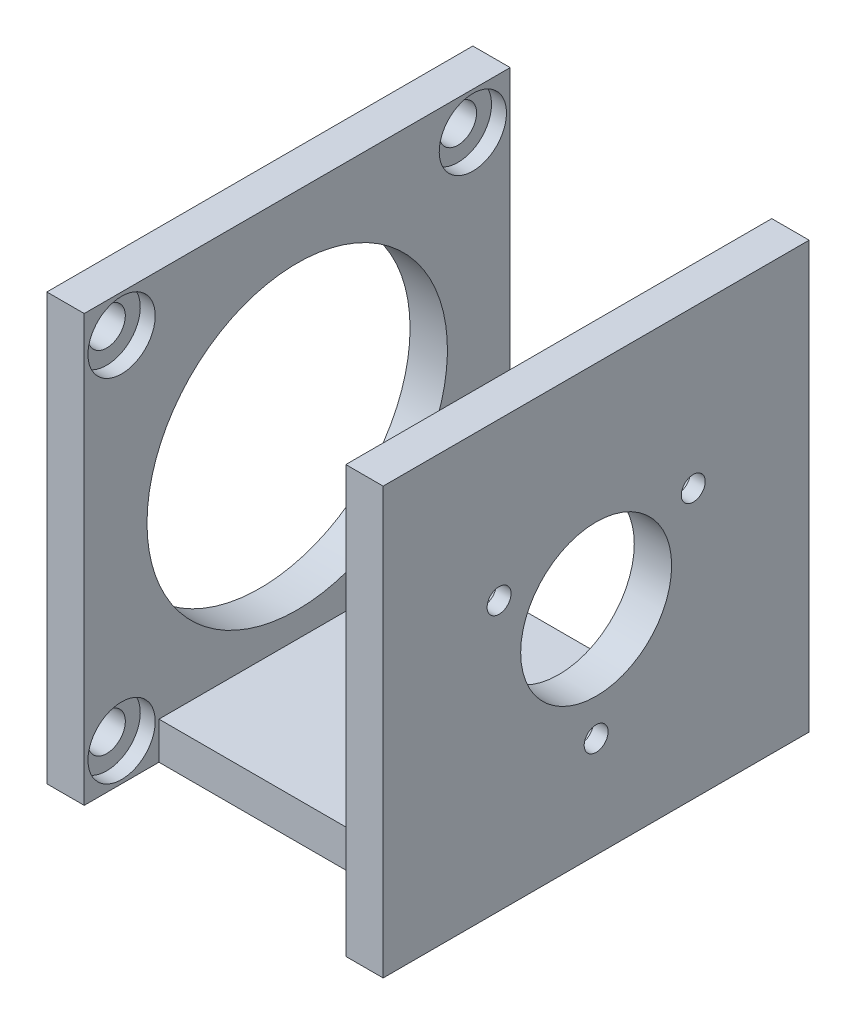
ISO-10303-21;
HEADER;
FILE_DESCRIPTION(('STEP AP214'),'2;1');
FILE_NAME('part.step','',(''),(''),'','','');
FILE_SCHEMA(('AUTOMOTIVE_DESIGN { 1 0 10303 214 1 1 1 1 }'));
ENDSEC;
DATA;
#1=APPLICATION_CONTEXT('core data for automotive mechanical design processes');
#2=APPLICATION_PROTOCOL_DEFINITION('international standard','automotive_design',2000,#1);
#3=PRODUCT_CONTEXT('',#1,'mechanical');
#4=PRODUCT('Part','Part','',(#3));
#5=PRODUCT_RELATED_PRODUCT_CATEGORY('part','',(#4));
#6=PRODUCT_DEFINITION_FORMATION('','',#4);
#7=PRODUCT_DEFINITION_CONTEXT('part definition',#1,'design');
#8=PRODUCT_DEFINITION('design','',#6,#7);
#9=PRODUCT_DEFINITION_SHAPE('','',#8);
#10=(LENGTH_UNIT() NAMED_UNIT(*) SI_UNIT(.MILLI.,.METRE.));
#11=(NAMED_UNIT(*) PLANE_ANGLE_UNIT() SI_UNIT($,.RADIAN.));
#12=(NAMED_UNIT(*) SI_UNIT($,.STERADIAN.) SOLID_ANGLE_UNIT());
#13=UNCERTAINTY_MEASURE_WITH_UNIT(LENGTH_MEASURE(1.E-05),#10,'distance_accuracy_value','');
#14=(GEOMETRIC_REPRESENTATION_CONTEXT(3) GLOBAL_UNCERTAINTY_ASSIGNED_CONTEXT((#13)) GLOBAL_UNIT_ASSIGNED_CONTEXT((#10,
#11,#12)) REPRESENTATION_CONTEXT('',''));
#15=CARTESIAN_POINT('',(0.,0.,0.));
#16=DIRECTION('',(0.,0.,1.));
#17=DIRECTION('',(1.,0.,0.));
#18=AXIS2_PLACEMENT_3D('',#15,#16,#17);
#19=CARTESIAN_POINT('',(-0.00100000000000794,35.9999999999999,15.5096189432333));
#20=DIRECTION('',(1.,0.,0.));
#21=DIRECTION('',(0.,1.,0.));
#22=AXIS2_PLACEMENT_3D('',#19,#20,#21);
#23=CYLINDRICAL_SURFACE('',#22,1.6);
#24=CARTESIAN_POINT('',(45.,35.9999999999999,15.5096189432333));
#25=DIRECTION('',(1.,0.,0.));
#26=DIRECTION('',(0.,1.,0.));
#27=AXIS2_PLACEMENT_3D('',#24,#25,#26);
#28=CIRCLE('',#27,1.6);
#29=CARTESIAN_POINT('',(45.,37.5999999999999,15.5096189432333));
#30=VERTEX_POINT('',#29);
#31=EDGE_CURVE('E177',#30,#30,#28,.T.);
#32=ORIENTED_EDGE('',*,*,#31,.T.);
#33=EDGE_LOOP('',(#32));
#34=FACE_BOUND('',#33,.T.);
#35=CARTESIAN_POINT('',(43.,35.9999999999999,15.5096189432333));
#36=DIRECTION('',(-1.,0.,0.));
#37=DIRECTION('',(0.,0.,1.));
#38=AXIS2_PLACEMENT_3D('',#35,#36,#37);
#39=CIRCLE('',#38,1.6);
#40=CARTESIAN_POINT('',(43.,35.9999999999999,17.1096189432333));
#41=VERTEX_POINT('',#40);
#42=EDGE_CURVE('E47',#41,#41,#39,.F.);
#43=ORIENTED_EDGE('',*,*,#42,.F.);
#44=EDGE_LOOP('',(#43));
#45=FACE_BOUND('',#44,.T.);
#46=ADVANCED_FACE('F43',(#34,#45),#23,.F.);
#47=CARTESIAN_POINT('',(-0.00100000000000794,36.0000000000001,41.4903810567665));
#48=DIRECTION('',(1.,0.,0.));
#49=DIRECTION('',(0.,1.,0.));
#50=AXIS2_PLACEMENT_3D('',#47,#48,#49);
#51=CYLINDRICAL_SURFACE('',#50,1.6);
#52=CARTESIAN_POINT('',(45.,36.0000000000001,41.4903810567665));
#53=DIRECTION('',(1.,0.,0.));
#54=DIRECTION('',(0.,1.,0.));
#55=AXIS2_PLACEMENT_3D('',#52,#53,#54);
#56=CIRCLE('',#55,1.6);
#57=CARTESIAN_POINT('',(45.,37.6000000000001,41.4903810567665));
#58=VERTEX_POINT('',#57);
#59=EDGE_CURVE('E181',#58,#58,#56,.T.);
#60=ORIENTED_EDGE('',*,*,#59,.T.);
#61=EDGE_LOOP('',(#60));
#62=FACE_BOUND('',#61,.T.);
#63=CARTESIAN_POINT('',(43.,36.0000000000001,41.4903810567665));
#64=DIRECTION('',(-1.,0.,0.));
#65=DIRECTION('',(0.,0.,1.));
#66=AXIS2_PLACEMENT_3D('',#63,#64,#65);
#67=CIRCLE('',#66,1.6);
#68=CARTESIAN_POINT('',(43.,36.0000000000001,43.0903810567665));
#69=VERTEX_POINT('',#68);
#70=EDGE_CURVE('E171',#69,#69,#67,.F.);
#71=ORIENTED_EDGE('',*,*,#70,.F.);
#72=EDGE_LOOP('',(#71));
#73=FACE_BOUND('',#72,.T.);
#74=ADVANCED_FACE('F347',(#62,#73),#51,.F.);
#75=CARTESIAN_POINT('',(-0.001000000000001,13.5,28.5));
#76=DIRECTION('',(1.,0.,0.));
#77=DIRECTION('',(0.,1.,0.));
#78=AXIS2_PLACEMENT_3D('',#75,#76,#77);
#79=CYLINDRICAL_SURFACE('',#78,1.6);
#80=CARTESIAN_POINT('',(45.,13.5,28.5));
#81=DIRECTION('',(1.,0.,0.));
#82=DIRECTION('',(0.,1.,0.));
#83=AXIS2_PLACEMENT_3D('',#80,#81,#82);
#84=CIRCLE('',#83,1.6);
#85=CARTESIAN_POINT('',(45.,15.1,28.5));
#86=VERTEX_POINT('',#85);
#87=EDGE_CURVE('E186',#86,#86,#84,.T.);
#88=ORIENTED_EDGE('',*,*,#87,.T.);
#89=EDGE_LOOP('',(#88));
#90=FACE_BOUND('',#89,.T.);
#91=CARTESIAN_POINT('',(43.,13.5,28.5));
#92=DIRECTION('',(-1.,0.,0.));
#93=DIRECTION('',(0.,0.,1.));
#94=AXIS2_PLACEMENT_3D('',#91,#92,#93);
#95=CIRCLE('',#94,1.6);
#96=CARTESIAN_POINT('',(43.,13.5,30.1));
#97=VERTEX_POINT('',#96);
#98=EDGE_CURVE('E169',#97,#97,#95,.F.);
#99=ORIENTED_EDGE('',*,*,#98,.F.);
#100=EDGE_LOOP('',(#99));
#101=FACE_BOUND('',#100,.T.);
#102=ADVANCED_FACE('F352',(#90,#101),#79,.F.);
#103=CARTESIAN_POINT('',(0.,0.,57.));
#104=DIRECTION('',(0.,0.,-1.));
#105=DIRECTION('',(-1.,0.,0.));
#106=AXIS2_PLACEMENT_3D('',#103,#104,#105);
#107=PLANE('',#106);
#108=DIRECTION('',(1.,0.,0.));
#109=VECTOR('',#108,1.);
#110=CARTESIAN_POINT('',(45.,0.,57.));
#111=LINE('',#110,#109);
#112=CARTESIAN_POINT('',(0.,0.,57.));
#113=VERTEX_POINT('',#112);
#114=CARTESIAN_POINT('',(5.,0.,57.));
#115=VERTEX_POINT('',#114);
#116=EDGE_CURVE('E120',#113,#115,#111,.T.);
#117=ORIENTED_EDGE('',*,*,#116,.T.);
#118=DIRECTION('',(0.,1.,0.));
#119=VECTOR('',#118,1.);
#120=CARTESIAN_POINT('',(5.,57.,57.));
#121=LINE('',#120,#119);
#122=CARTESIAN_POINT('',(5.,57.,57.));
#123=VERTEX_POINT('',#122);
#124=EDGE_CURVE('E112',#115,#123,#121,.T.);
#125=ORIENTED_EDGE('',*,*,#124,.T.);
#126=DIRECTION('',(-1.,0.,0.));
#127=VECTOR('',#126,1.);
#128=CARTESIAN_POINT('',(0.,57.,57.));
#129=LINE('',#128,#127);
#130=CARTESIAN_POINT('',(0.,57.,57.));
#131=VERTEX_POINT('',#130);
#132=EDGE_CURVE('E116',#123,#131,#129,.T.);
#133=ORIENTED_EDGE('',*,*,#132,.T.);
#134=DIRECTION('',(0.,-1.,0.));
#135=VECTOR('',#134,1.);
#136=CARTESIAN_POINT('',(0.,0.,57.));
#137=LINE('',#136,#135);
#138=EDGE_CURVE('E69',#131,#113,#137,.T.);
#139=ORIENTED_EDGE('',*,*,#138,.T.);
#140=EDGE_LOOP('',(#117,#125,#133,#139));
#141=FACE_BOUND('',#140,.T.);
#142=ADVANCED_FACE('F114',(#141),#107,.F.);
#143=CARTESIAN_POINT('',(0.,0.,0.));
#144=DIRECTION('',(0.,0.,-1.));
#145=DIRECTION('',(-1.,0.,0.));
#146=AXIS2_PLACEMENT_3D('',#143,#144,#145);
#147=PLANE('',#146);
#148=DIRECTION('',(0.,1.,0.));
#149=VECTOR('',#148,1.);
#150=CARTESIAN_POINT('',(5.,57.,0.));
#151=LINE('',#150,#149);
#152=CARTESIAN_POINT('',(5.,0.,0.));
#153=VERTEX_POINT('',#152);
#154=CARTESIAN_POINT('',(5.,57.,0.));
#155=VERTEX_POINT('',#154);
#156=EDGE_CURVE('E130',#153,#155,#151,.T.);
#157=ORIENTED_EDGE('',*,*,#156,.F.);
#158=DIRECTION('',(1.,0.,0.));
#159=VECTOR('',#158,1.);
#160=CARTESIAN_POINT('',(45.,0.,0.));
#161=LINE('',#160,#159);
#162=CARTESIAN_POINT('',(0.,0.,0.));
#163=VERTEX_POINT('',#162);
#164=EDGE_CURVE('E142',#163,#153,#161,.T.);
#165=ORIENTED_EDGE('',*,*,#164,.F.);
#166=DIRECTION('',(0.,-1.,0.));
#167=VECTOR('',#166,1.);
#168=CARTESIAN_POINT('',(0.,0.,0.));
#169=LINE('',#168,#167);
#170=CARTESIAN_POINT('',(0.,57.,0.));
#171=VERTEX_POINT('',#170);
#172=EDGE_CURVE('E96',#171,#163,#169,.T.);
#173=ORIENTED_EDGE('',*,*,#172,.F.);
#174=DIRECTION('',(-1.,0.,0.));
#175=VECTOR('',#174,1.);
#176=CARTESIAN_POINT('',(0.,57.,0.));
#177=LINE('',#176,#175);
#178=EDGE_CURVE('E154',#155,#171,#177,.T.);
#179=ORIENTED_EDGE('',*,*,#178,.F.);
#180=EDGE_LOOP('',(#157,#165,#173,#179));
#181=FACE_BOUND('',#180,.T.);
#182=ADVANCED_FACE('F333',(#181),#147,.T.);
#183=CARTESIAN_POINT('',(45.,0.,57.));
#184=DIRECTION('',(0.,1.,0.));
#185=DIRECTION('',(0.,0.,1.));
#186=AXIS2_PLACEMENT_3D('',#183,#184,#185);
#187=PLANE('',#186);
#188=DIRECTION('',(-1.,0.,0.));
#189=VECTOR('',#188,1.);
#190=CARTESIAN_POINT('',(5.,0.,47.));
#191=LINE('',#190,#189);
#192=CARTESIAN_POINT('',(40.,0.,47.));
#193=VERTEX_POINT('',#192);
#194=CARTESIAN_POINT('',(5.,0.,47.));
#195=VERTEX_POINT('',#194);
#196=EDGE_CURVE('E257',#193,#195,#191,.T.);
#197=ORIENTED_EDGE('',*,*,#196,.T.);
#198=DIRECTION('',(0.,0.,1.));
#199=VECTOR('',#198,1.);
#200=CARTESIAN_POINT('',(5.,0.,57.));
#201=LINE('',#200,#199);
#202=EDGE_CURVE('E251',#195,#115,#201,.T.);
#203=ORIENTED_EDGE('',*,*,#202,.T.);
#204=ORIENTED_EDGE('',*,*,#116,.F.);
#205=DIRECTION('',(0.,0.,-1.));
#206=VECTOR('',#205,1.);
#207=CARTESIAN_POINT('',(0.,0.,57.));
#208=LINE('',#207,#206);
#209=EDGE_CURVE('E138',#113,#163,#208,.T.);
#210=ORIENTED_EDGE('',*,*,#209,.T.);
#211=ORIENTED_EDGE('',*,*,#164,.T.);
#212=DIRECTION('',(0.,0.,1.));
#213=VECTOR('',#212,1.);
#214=CARTESIAN_POINT('',(5.,0.,0.));
#215=LINE('',#214,#213);
#216=CARTESIAN_POINT('',(5.,0.,10.));
#217=VERTEX_POINT('',#216);
#218=EDGE_CURVE('E277',#153,#217,#215,.T.);
#219=ORIENTED_EDGE('',*,*,#218,.T.);
#220=DIRECTION('',(1.,0.,0.));
#221=VECTOR('',#220,1.);
#222=CARTESIAN_POINT('',(5.,0.,10.));
#223=LINE('',#222,#221);
#224=CARTESIAN_POINT('',(40.,0.,10.));
#225=VERTEX_POINT('',#224);
#226=EDGE_CURVE('E280',#217,#225,#223,.T.);
#227=ORIENTED_EDGE('',*,*,#226,.T.);
#228=DIRECTION('',(0.,0.,-1.));
#229=VECTOR('',#228,1.);
#230=CARTESIAN_POINT('',(40.,0.,0.));
#231=LINE('',#230,#229);
#232=CARTESIAN_POINT('',(40.,0.,0.));
#233=VERTEX_POINT('',#232);
#234=EDGE_CURVE('E272',#225,#233,#231,.T.);
#235=ORIENTED_EDGE('',*,*,#234,.T.);
#236=CARTESIAN_POINT('',(45.,0.,0.));
#237=VERTEX_POINT('',#236);
#238=EDGE_CURVE('E146',#233,#237,#161,.T.);
#239=ORIENTED_EDGE('',*,*,#238,.T.);
#240=DIRECTION('',(0.,0.,-1.));
#241=VECTOR('',#240,1.);
#242=CARTESIAN_POINT('',(45.,0.,57.));
#243=LINE('',#242,#241);
#244=CARTESIAN_POINT('',(45.,0.,57.));
#245=VERTEX_POINT('',#244);
#246=EDGE_CURVE('E11',#245,#237,#243,.T.);
#247=ORIENTED_EDGE('',*,*,#246,.F.);
#248=CARTESIAN_POINT('',(40.,0.,57.));
#249=VERTEX_POINT('',#248);
#250=EDGE_CURVE('E102',#249,#245,#111,.T.);
#251=ORIENTED_EDGE('',*,*,#250,.F.);
#252=DIRECTION('',(0.,0.,-1.));
#253=VECTOR('',#252,1.);
#254=CARTESIAN_POINT('',(40.,0.,57.));
#255=LINE('',#254,#253);
#256=EDGE_CURVE('E253',#249,#193,#255,.T.);
#257=ORIENTED_EDGE('',*,*,#256,.T.);
#258=EDGE_LOOP('',(#197,#203,#204,#210,#211,#219,#227,#235,#239,#247,#251,#257));
#259=FACE_BOUND('',#258,.T.);
#260=ADVANCED_FACE('F45',(#259),#187,.F.);
#261=CARTESIAN_POINT('',(45.,57.,57.));
#262=DIRECTION('',(-1.,0.,0.));
#263=DIRECTION('',(0.,-1.,0.));
#264=AXIS2_PLACEMENT_3D('',#261,#262,#263);
#265=PLANE('',#264);
#266=ORIENTED_EDGE('',*,*,#87,.F.);
#267=EDGE_LOOP('',(#266));
#268=FACE_BOUND('',#267,.T.);
#269=ORIENTED_EDGE('',*,*,#59,.F.);
#270=EDGE_LOOP('',(#269));
#271=FACE_BOUND('',#270,.T.);
#272=ORIENTED_EDGE('',*,*,#31,.F.);
#273=EDGE_LOOP('',(#272));
#274=FACE_BOUND('',#273,.T.);
#275=CARTESIAN_POINT('',(45.,28.5,28.5));
#276=DIRECTION('',(1.,0.,0.));
#277=DIRECTION('',(0.,1.,0.));
#278=AXIS2_PLACEMENT_3D('',#275,#276,#277);
#279=CIRCLE('',#278,10.1);
#280=CARTESIAN_POINT('',(45.,38.6,28.5));
#281=VERTEX_POINT('',#280);
#282=EDGE_CURVE('E190',#281,#281,#279,.T.);
#283=ORIENTED_EDGE('',*,*,#282,.F.);
#284=EDGE_LOOP('',(#283));
#285=FACE_BOUND('',#284,.T.);
#286=DIRECTION('',(0.,1.,0.));
#287=VECTOR('',#286,1.);
#288=CARTESIAN_POINT('',(45.,57.,0.));
#289=LINE('',#288,#287);
#290=CARTESIAN_POINT('',(45.,57.,0.));
#291=VERTEX_POINT('',#290);
#292=EDGE_CURVE('E145',#237,#291,#289,.T.);
#293=ORIENTED_EDGE('',*,*,#292,.T.);
#294=DIRECTION('',(0.,0.,-1.));
#295=VECTOR('',#294,1.);
#296=CARTESIAN_POINT('',(45.,57.,57.));
#297=LINE('',#296,#295);
#298=CARTESIAN_POINT('',(45.,57.,57.));
#299=VERTEX_POINT('',#298);
#300=EDGE_CURVE('E52',#299,#291,#297,.T.);
#301=ORIENTED_EDGE('',*,*,#300,.F.);
#302=DIRECTION('',(0.,1.,0.));
#303=VECTOR('',#302,1.);
#304=CARTESIAN_POINT('',(45.,57.,57.));
#305=LINE('',#304,#303);
#306=EDGE_CURVE('E286',#245,#299,#305,.T.);
#307=ORIENTED_EDGE('',*,*,#306,.F.);
#308=ORIENTED_EDGE('',*,*,#246,.T.);
#309=EDGE_LOOP('',(#293,#301,#307,#308));
#310=FACE_BOUND('',#309,.T.);
#311=ADVANCED_FACE('F308',(#268,#271,#274,#285,#310),#265,.F.);
#312=CARTESIAN_POINT('',(40.,57.,57.));
#313=DIRECTION('',(0.,-1.,0.));
#314=DIRECTION('',(0.,0.,-1.));
#315=AXIS2_PLACEMENT_3D('',#312,#313,#314);
#316=PLANE('',#315);
#317=DIRECTION('',(-1.,0.,0.));
#318=VECTOR('',#317,1.);
#319=CARTESIAN_POINT('',(40.,57.,0.));
#320=LINE('',#319,#318);
#321=CARTESIAN_POINT('',(40.,57.,0.));
#322=VERTEX_POINT('',#321);
#323=EDGE_CURVE('E148',#291,#322,#320,.T.);
#324=ORIENTED_EDGE('',*,*,#323,.T.);
#325=DIRECTION('',(0.,0.,-1.));
#326=VECTOR('',#325,1.);
#327=CARTESIAN_POINT('',(40.,57.,57.));
#328=LINE('',#327,#326);
#329=CARTESIAN_POINT('',(40.,57.,57.));
#330=VERTEX_POINT('',#329);
#331=EDGE_CURVE('E164',#330,#322,#328,.T.);
#332=ORIENTED_EDGE('',*,*,#331,.F.);
#333=DIRECTION('',(-1.,0.,0.));
#334=VECTOR('',#333,1.);
#335=CARTESIAN_POINT('',(40.,57.,57.));
#336=LINE('',#335,#334);
#337=EDGE_CURVE('E288',#299,#330,#336,.T.);
#338=ORIENTED_EDGE('',*,*,#337,.F.);
#339=ORIENTED_EDGE('',*,*,#300,.T.);
#340=EDGE_LOOP('',(#324,#332,#338,#339));
#341=FACE_BOUND('',#340,.T.);
#342=ADVANCED_FACE('F294',(#341),#316,.F.);
#343=CARTESIAN_POINT('',(40.,5.,57.));
#344=DIRECTION('',(1.,0.,0.));
#345=DIRECTION('',(0.,0.,-1.));
#346=AXIS2_PLACEMENT_3D('',#343,#344,#345);
#347=PLANE('',#346);
#348=CARTESIAN_POINT('',(40.,13.5,28.5));
#349=DIRECTION('',(-1.,0.,0.));
#350=DIRECTION('',(0.,0.,1.));
#351=AXIS2_PLACEMENT_3D('',#348,#349,#350);
#352=CIRCLE('',#351,3.1);
#353=CARTESIAN_POINT('',(40.,13.5,31.6));
#354=VERTEX_POINT('',#353);
#355=EDGE_CURVE('E465',#354,#354,#352,.T.);
#356=ORIENTED_EDGE('',*,*,#355,.F.);
#357=EDGE_LOOP('',(#356));
#358=FACE_BOUND('',#357,.T.);
#359=CARTESIAN_POINT('',(40.,36.0000000000001,15.5096189432335));
#360=DIRECTION('',(-1.,0.,0.));
#361=DIRECTION('',(0.,0.,1.));
#362=AXIS2_PLACEMENT_3D('',#359,#360,#361);
#363=CIRCLE('',#362,3.1);
#364=CARTESIAN_POINT('',(40.,36.0000000000001,18.6096189432335));
#365=VERTEX_POINT('',#364);
#366=EDGE_CURVE('E468',#365,#365,#363,.T.);
#367=ORIENTED_EDGE('',*,*,#366,.F.);
#368=EDGE_LOOP('',(#367));
#369=FACE_BOUND('',#368,.T.);
#370=CARTESIAN_POINT('',(40.,35.9999999999999,41.4903810567667));
#371=DIRECTION('',(-1.,0.,0.));
#372=DIRECTION('',(0.,0.,1.));
#373=AXIS2_PLACEMENT_3D('',#370,#371,#372);
#374=CIRCLE('',#373,3.1);
#375=CARTESIAN_POINT('',(40.,35.9999999999999,44.5903810567667));
#376=VERTEX_POINT('',#375);
#377=EDGE_CURVE('E476',#376,#376,#374,.T.);
#378=ORIENTED_EDGE('',*,*,#377,.F.);
#379=EDGE_LOOP('',(#378));
#380=FACE_BOUND('',#379,.T.);
#381=CARTESIAN_POINT('',(40.,28.5,28.5));
#382=DIRECTION('',(1.,0.,0.));
#383=DIRECTION('',(0.,0.,-1.));
#384=AXIS2_PLACEMENT_3D('',#381,#382,#383);
#385=CIRCLE('',#384,10.1);
#386=CARTESIAN_POINT('',(40.,28.5,18.4));
#387=VERTEX_POINT('',#386);
#388=EDGE_CURVE('E193',#387,#387,#385,.F.);
#389=ORIENTED_EDGE('',*,*,#388,.F.);
#390=EDGE_LOOP('',(#389));
#391=FACE_BOUND('',#390,.T.);
#392=DIRECTION('',(0.,-1.,0.));
#393=VECTOR('',#392,1.);
#394=CARTESIAN_POINT('',(40.,5.,0.));
#395=LINE('',#394,#393);
#396=EDGE_CURVE('E150',#322,#233,#395,.T.);
#397=ORIENTED_EDGE('',*,*,#396,.T.);
#398=ORIENTED_EDGE('',*,*,#234,.F.);
#399=DIRECTION('',(0.,1.,0.));
#400=VECTOR('',#399,1.);
#401=CARTESIAN_POINT('',(40.,0.,10.));
#402=LINE('',#401,#400);
#403=CARTESIAN_POINT('',(40.,4.99999999999999,10.));
#404=VERTEX_POINT('',#403);
#405=EDGE_CURVE('E250',#225,#404,#402,.T.);
#406=ORIENTED_EDGE('',*,*,#405,.T.);
#407=DIRECTION('',(0.,0.,-1.));
#408=VECTOR('',#407,1.);
#409=CARTESIAN_POINT('',(40.,5.,57.));
#410=LINE('',#409,#408);
#411=CARTESIAN_POINT('',(40.,4.99999999999999,47.));
#412=VERTEX_POINT('',#411);
#413=EDGE_CURVE('E161',#412,#404,#410,.T.);
#414=ORIENTED_EDGE('',*,*,#413,.F.);
#415=DIRECTION('',(0.,1.,0.));
#416=VECTOR('',#415,1.);
#417=CARTESIAN_POINT('',(40.,0.,47.));
#418=LINE('',#417,#416);
#419=EDGE_CURVE('E260',#193,#412,#418,.T.);
#420=ORIENTED_EDGE('',*,*,#419,.F.);
#421=ORIENTED_EDGE('',*,*,#256,.F.);
#422=DIRECTION('',(0.,-1.,0.));
#423=VECTOR('',#422,1.);
#424=CARTESIAN_POINT('',(40.,5.,57.));
#425=LINE('',#424,#423);
#426=EDGE_CURVE('E60',#330,#249,#425,.T.);
#427=ORIENTED_EDGE('',*,*,#426,.F.);
#428=ORIENTED_EDGE('',*,*,#331,.T.);
#429=EDGE_LOOP('',(#397,#398,#406,#414,#420,#421,#427,#428));
#430=FACE_BOUND('',#429,.T.);
#431=ADVANCED_FACE('F298',(#358,#369,#380,#391,#430),#347,.F.);
#432=CARTESIAN_POINT('',(5.00000000000001,5.,57.));
#433=DIRECTION('',(0.,-1.,0.));
#434=DIRECTION('',(0.,0.,-1.));
#435=AXIS2_PLACEMENT_3D('',#432,#433,#434);
#436=PLANE('',#435);
#437=DIRECTION('',(0.,0.,-1.));
#438=VECTOR('',#437,1.);
#439=CARTESIAN_POINT('',(5.00000000000001,5.,57.));
#440=LINE('',#439,#438);
#441=CARTESIAN_POINT('',(5.,5.,47.));
#442=VERTEX_POINT('',#441);
#443=CARTESIAN_POINT('',(5.,5.,10.));
#444=VERTEX_POINT('',#443);
#445=EDGE_CURVE('E133',#442,#444,#440,.T.);
#446=ORIENTED_EDGE('',*,*,#445,.F.);
#447=DIRECTION('',(-1.,0.,0.));
#448=VECTOR('',#447,1.);
#449=CARTESIAN_POINT('',(5.,5.,47.));
#450=LINE('',#449,#448);
#451=EDGE_CURVE('E254',#412,#442,#450,.T.);
#452=ORIENTED_EDGE('',*,*,#451,.F.);
#453=ORIENTED_EDGE('',*,*,#413,.T.);
#454=DIRECTION('',(1.,0.,0.));
#455=VECTOR('',#454,1.);
#456=CARTESIAN_POINT('',(5.,5.,10.));
#457=LINE('',#456,#455);
#458=EDGE_CURVE('E263',#444,#404,#457,.T.);
#459=ORIENTED_EDGE('',*,*,#458,.F.);
#460=EDGE_LOOP('',(#446,#452,#453,#459));
#461=FACE_BOUND('',#460,.T.);
#462=ADVANCED_FACE('F493',(#461),#436,.F.);
#463=CARTESIAN_POINT('',(5.,57.,57.));
#464=DIRECTION('',(-1.,0.,0.));
#465=DIRECTION('',(0.,-1.,0.));
#466=AXIS2_PLACEMENT_3D('',#463,#464,#465);
#467=PLANE('',#466);
#468=CARTESIAN_POINT('',(5.00000000000001,5.00000000000023,51.9999999999996));
#469=DIRECTION('',(1.,0.,0.));
#470=DIRECTION('',(0.,1.,0.));
#471=AXIS2_PLACEMENT_3D('',#468,#469,#470);
#472=CIRCLE('',#471,4.5);
#473=CARTESIAN_POINT('',(5.00000000000001,9.50000000000023,51.9999999999996));
#474=VERTEX_POINT('',#473);
#475=EDGE_CURVE('E234',#474,#474,#472,.T.);
#476=ORIENTED_EDGE('',*,*,#475,.F.);
#477=EDGE_LOOP('',(#476));
#478=FACE_BOUND('',#477,.T.);
#479=CARTESIAN_POINT('',(5.00000000000001,5.00000000000049,4.99999999999952));
#480=DIRECTION('',(1.,0.,0.));
#481=DIRECTION('',(0.,1.,0.));
#482=AXIS2_PLACEMENT_3D('',#479,#480,#481);
#483=CIRCLE('',#482,4.5);
#484=CARTESIAN_POINT('',(5.00000000000001,9.50000000000049,4.99999999999952));
#485=VERTEX_POINT('',#484);
#486=EDGE_CURVE('E228',#485,#485,#483,.T.);
#487=ORIENTED_EDGE('',*,*,#486,.F.);
#488=EDGE_LOOP('',(#487));
#489=FACE_BOUND('',#488,.T.);
#490=CARTESIAN_POINT('',(5.,52.0000000000006,4.99999999999994));
#491=DIRECTION('',(1.,0.,0.));
#492=DIRECTION('',(0.,1.,0.));
#493=AXIS2_PLACEMENT_3D('',#490,#491,#492);
#494=CIRCLE('',#493,4.5);
#495=CARTESIAN_POINT('',(5.,56.5000000000006,4.99999999999994));
#496=VERTEX_POINT('',#495);
#497=EDGE_CURVE('E221',#496,#496,#494,.T.);
#498=ORIENTED_EDGE('',*,*,#497,.F.);
#499=EDGE_LOOP('',(#498));
#500=FACE_BOUND('',#499,.T.);
#501=CARTESIAN_POINT('',(5.,52.,52.));
#502=DIRECTION('',(1.,0.,0.));
#503=DIRECTION('',(0.,1.,0.));
#504=AXIS2_PLACEMENT_3D('',#501,#502,#503);
#505=CIRCLE('',#504,4.5);
#506=CARTESIAN_POINT('',(5.,56.5,52.));
#507=VERTEX_POINT('',#506);
#508=EDGE_CURVE('E224',#507,#507,#505,.T.);
#509=ORIENTED_EDGE('',*,*,#508,.F.);
#510=EDGE_LOOP('',(#509));
#511=FACE_BOUND('',#510,.T.);
#512=CARTESIAN_POINT('',(5.,28.5,28.5));
#513=DIRECTION('',(-1.,0.,0.));
#514=DIRECTION('',(0.,-1.,0.));
#515=AXIS2_PLACEMENT_3D('',#512,#513,#514);
#516=CIRCLE('',#515,20.1);
#517=CARTESIAN_POINT('',(5.,8.4,28.5));
#518=VERTEX_POINT('',#517);
#519=EDGE_CURVE('E242',#518,#518,#516,.F.);
#520=ORIENTED_EDGE('',*,*,#519,.F.);
#521=EDGE_LOOP('',(#520));
#522=FACE_BOUND('',#521,.T.);
#523=ORIENTED_EDGE('',*,*,#156,.T.);
#524=DIRECTION('',(0.,0.,-1.));
#525=VECTOR('',#524,1.);
#526=CARTESIAN_POINT('',(5.,57.,57.));
#527=LINE('',#526,#525);
#528=EDGE_CURVE('E126',#123,#155,#527,.T.);
#529=ORIENTED_EDGE('',*,*,#528,.F.);
#530=ORIENTED_EDGE('',*,*,#124,.F.);
#531=ORIENTED_EDGE('',*,*,#202,.F.);
#532=DIRECTION('',(0.,1.,0.));
#533=VECTOR('',#532,1.);
#534=CARTESIAN_POINT('',(5.,0.,47.));
#535=LINE('',#534,#533);
#536=EDGE_CURVE('E264',#195,#442,#535,.T.);
#537=ORIENTED_EDGE('',*,*,#536,.T.);
#538=ORIENTED_EDGE('',*,*,#445,.T.);
#539=DIRECTION('',(0.,1.,0.));
#540=VECTOR('',#539,1.);
#541=CARTESIAN_POINT('',(5.,0.,10.));
#542=LINE('',#541,#540);
#543=EDGE_CURVE('E269',#217,#444,#542,.T.);
#544=ORIENTED_EDGE('',*,*,#543,.F.);
#545=ORIENTED_EDGE('',*,*,#218,.F.);
#546=EDGE_LOOP('',(#523,#529,#530,#531,#537,#538,#544,#545));
#547=FACE_BOUND('',#546,.T.);
#548=ADVANCED_FACE('F127',(#478,#489,#500,#511,#522,#547),#467,.F.);
#549=CARTESIAN_POINT('',(0.,57.,57.));
#550=DIRECTION('',(0.,-1.,0.));
#551=DIRECTION('',(0.,0.,-1.));
#552=AXIS2_PLACEMENT_3D('',#549,#550,#551);
#553=PLANE('',#552);
#554=ORIENTED_EDGE('',*,*,#178,.T.);
#555=DIRECTION('',(0.,0.,-1.));
#556=VECTOR('',#555,1.);
#557=CARTESIAN_POINT('',(0.,57.,57.));
#558=LINE('',#557,#556);
#559=EDGE_CURVE('E134',#131,#171,#558,.T.);
#560=ORIENTED_EDGE('',*,*,#559,.F.);
#561=ORIENTED_EDGE('',*,*,#132,.F.);
#562=ORIENTED_EDGE('',*,*,#528,.T.);
#563=EDGE_LOOP('',(#554,#560,#561,#562));
#564=FACE_BOUND('',#563,.T.);
#565=ADVANCED_FACE('F136',(#564),#553,.F.);
#566=CARTESIAN_POINT('',(0.,0.,57.));
#567=DIRECTION('',(1.,0.,0.));
#568=DIRECTION('',(0.,0.,-1.));
#569=AXIS2_PLACEMENT_3D('',#566,#567,#568);
#570=PLANE('',#569);
#571=CARTESIAN_POINT('',(0.,5.00000000000023,51.9999999999989));
#572=DIRECTION('',(1.,0.,0.));
#573=DIRECTION('',(0.,0.,-1.));
#574=AXIS2_PLACEMENT_3D('',#571,#572,#573);
#575=CIRCLE('',#574,2.50000000000001);
#576=CARTESIAN_POINT('',(0.,5.00000000000023,49.4999999999989));
#577=VERTEX_POINT('',#576);
#578=EDGE_CURVE('E208',#577,#577,#575,.T.);
#579=ORIENTED_EDGE('',*,*,#578,.T.);
#580=EDGE_LOOP('',(#579));
#581=FACE_BOUND('',#580,.T.);
#582=CARTESIAN_POINT('',(0.,5.00000000000116,4.99999999999885));
#583=DIRECTION('',(1.,0.,0.));
#584=DIRECTION('',(0.,0.,-1.));
#585=AXIS2_PLACEMENT_3D('',#582,#583,#584);
#586=CIRCLE('',#585,2.50000000000001);
#587=CARTESIAN_POINT('',(0.,5.00000000000116,2.49999999999885));
#588=VERTEX_POINT('',#587);
#589=EDGE_CURVE('E201',#588,#588,#586,.T.);
#590=ORIENTED_EDGE('',*,*,#589,.T.);
#591=EDGE_LOOP('',(#590));
#592=FACE_BOUND('',#591,.T.);
#593=CARTESIAN_POINT('',(0.,52.0000000000012,4.99999999999994));
#594=DIRECTION('',(1.,0.,0.));
#595=DIRECTION('',(0.,0.,-1.));
#596=AXIS2_PLACEMENT_3D('',#593,#594,#595);
#597=CIRCLE('',#596,2.50000000000001);
#598=CARTESIAN_POINT('',(0.,52.0000000000012,2.49999999999994));
#599=VERTEX_POINT('',#598);
#600=EDGE_CURVE('E200',#599,#599,#597,.T.);
#601=ORIENTED_EDGE('',*,*,#600,.T.);
#602=EDGE_LOOP('',(#601));
#603=FACE_BOUND('',#602,.T.);
#604=CARTESIAN_POINT('',(0.,52.,52.));
#605=DIRECTION('',(1.,0.,0.));
#606=DIRECTION('',(0.,0.,-1.));
#607=AXIS2_PLACEMENT_3D('',#604,#605,#606);
#608=CIRCLE('',#607,2.5);
#609=CARTESIAN_POINT('',(0.,52.,49.5));
#610=VERTEX_POINT('',#609);
#611=EDGE_CURVE('E204',#610,#610,#608,.T.);
#612=ORIENTED_EDGE('',*,*,#611,.T.);
#613=EDGE_LOOP('',(#612));
#614=FACE_BOUND('',#613,.T.);
#615=CARTESIAN_POINT('',(0.,28.5,28.5));
#616=DIRECTION('',(-1.,0.,0.));
#617=DIRECTION('',(0.,0.,1.));
#618=AXIS2_PLACEMENT_3D('',#615,#616,#617);
#619=CIRCLE('',#618,20.1);
#620=CARTESIAN_POINT('',(0.,28.5,48.6));
#621=VERTEX_POINT('',#620);
#622=EDGE_CURVE('E247',#621,#621,#619,.T.);
#623=ORIENTED_EDGE('',*,*,#622,.F.);
#624=EDGE_LOOP('',(#623));
#625=FACE_BOUND('',#624,.T.);
#626=ORIENTED_EDGE('',*,*,#172,.T.);
#627=ORIENTED_EDGE('',*,*,#209,.F.);
#628=ORIENTED_EDGE('',*,*,#138,.F.);
#629=ORIENTED_EDGE('',*,*,#559,.T.);
#630=EDGE_LOOP('',(#626,#627,#628,#629));
#631=FACE_BOUND('',#630,.T.);
#632=ADVANCED_FACE('F334',(#581,#592,#603,#614,#625,#631),#570,.F.);
#633=ORIENTED_EDGE('',*,*,#426,.T.);
#634=ORIENTED_EDGE('',*,*,#250,.T.);
#635=ORIENTED_EDGE('',*,*,#306,.T.);
#636=ORIENTED_EDGE('',*,*,#337,.T.);
#637=EDGE_LOOP('',(#633,#634,#635,#636));
#638=FACE_BOUND('',#637,.T.);
#639=ADVANCED_FACE('F291',(#638),#107,.F.);
#640=ORIENTED_EDGE('',*,*,#238,.F.);
#641=ORIENTED_EDGE('',*,*,#396,.F.);
#642=ORIENTED_EDGE('',*,*,#323,.F.);
#643=ORIENTED_EDGE('',*,*,#292,.F.);
#644=EDGE_LOOP('',(#640,#641,#642,#643));
#645=FACE_BOUND('',#644,.T.);
#646=ADVANCED_FACE('F310',(#645),#147,.T.);
#647=CARTESIAN_POINT('',(5.,0.,10.));
#648=DIRECTION('',(0.,0.,1.));
#649=DIRECTION('',(1.,0.,0.));
#650=AXIS2_PLACEMENT_3D('',#647,#648,#649);
#651=PLANE('',#650);
#652=ORIENTED_EDGE('',*,*,#458,.T.);
#653=ORIENTED_EDGE('',*,*,#405,.F.);
#654=ORIENTED_EDGE('',*,*,#226,.F.);
#655=ORIENTED_EDGE('',*,*,#543,.T.);
#656=EDGE_LOOP('',(#652,#653,#654,#655));
#657=FACE_BOUND('',#656,.T.);
#658=ADVANCED_FACE('F319',(#657),#651,.F.);
#659=CARTESIAN_POINT('',(5.,0.,47.));
#660=DIRECTION('',(0.,0.,-1.));
#661=DIRECTION('',(-1.,0.,0.));
#662=AXIS2_PLACEMENT_3D('',#659,#660,#661);
#663=PLANE('',#662);
#664=ORIENTED_EDGE('',*,*,#451,.T.);
#665=ORIENTED_EDGE('',*,*,#536,.F.);
#666=ORIENTED_EDGE('',*,*,#196,.F.);
#667=ORIENTED_EDGE('',*,*,#419,.T.);
#668=EDGE_LOOP('',(#664,#665,#666,#667));
#669=FACE_BOUND('',#668,.T.);
#670=ADVANCED_FACE('F414',(#669),#663,.F.);
#671=CARTESIAN_POINT('',(45.001,28.5,28.5));
#672=DIRECTION('',(-1.,0.,0.));
#673=DIRECTION('',(0.,0.,1.));
#674=AXIS2_PLACEMENT_3D('',#671,#672,#673);
#675=CYLINDRICAL_SURFACE('',#674,20.1);
#676=ORIENTED_EDGE('',*,*,#622,.T.);
#677=EDGE_LOOP('',(#676));
#678=FACE_BOUND('',#677,.T.);
#679=ORIENTED_EDGE('',*,*,#519,.T.);
#680=EDGE_LOOP('',(#679));
#681=FACE_BOUND('',#680,.T.);
#682=ADVANCED_FACE('F410',(#678,#681),#675,.F.);
#683=CARTESIAN_POINT('',(3.,52.,52.));
#684=DIRECTION('',(1.,0.,0.));
#685=DIRECTION('',(0.,1.,0.));
#686=AXIS2_PLACEMENT_3D('',#683,#684,#685);
#687=CYLINDRICAL_SURFACE('',#686,4.5);
#688=CARTESIAN_POINT('',(3.,52.,52.));
#689=DIRECTION('',(1.,0.,0.));
#690=DIRECTION('',(0.,1.,0.));
#691=AXIS2_PLACEMENT_3D('',#688,#689,#690);
#692=CIRCLE('',#691,4.5);
#693=CARTESIAN_POINT('',(3.,56.5,52.));
#694=VERTEX_POINT('',#693);
#695=EDGE_CURVE('E239',#694,#694,#692,.T.);
#696=ORIENTED_EDGE('',*,*,#695,.F.);
#697=EDGE_LOOP('',(#696));
#698=FACE_BOUND('',#697,.T.);
#699=ORIENTED_EDGE('',*,*,#508,.T.);
#700=EDGE_LOOP('',(#699));
#701=FACE_BOUND('',#700,.T.);
#702=ADVANCED_FACE('F406',(#698,#701),#687,.F.);
#703=CARTESIAN_POINT('',(3.,52.,52.));
#704=DIRECTION('',(1.,0.,0.));
#705=DIRECTION('',(0.,1.,0.));
#706=AXIS2_PLACEMENT_3D('',#703,#704,#705);
#707=PLANE('',#706);
#708=CARTESIAN_POINT('',(3.,52.,52.));
#709=DIRECTION('',(1.,0.,0.));
#710=DIRECTION('',(0.,1.,0.));
#711=AXIS2_PLACEMENT_3D('',#708,#709,#710);
#712=CIRCLE('',#711,2.5);
#713=CARTESIAN_POINT('',(3.,54.5,52.));
#714=VERTEX_POINT('',#713);
#715=EDGE_CURVE('E217',#714,#714,#712,.T.);
#716=ORIENTED_EDGE('',*,*,#715,.F.);
#717=EDGE_LOOP('',(#716));
#718=FACE_BOUND('',#717,.T.);
#719=ORIENTED_EDGE('',*,*,#695,.T.);
#720=EDGE_LOOP('',(#719));
#721=FACE_BOUND('',#720,.T.);
#722=ADVANCED_FACE('F384',(#718,#721),#707,.T.);
#723=CARTESIAN_POINT('',(3.,52.0000000000006,4.99999999999994));
#724=DIRECTION('',(1.,0.,0.));
#725=DIRECTION('',(0.,1.,0.));
#726=AXIS2_PLACEMENT_3D('',#723,#724,#725);
#727=CYLINDRICAL_SURFACE('',#726,4.5);
#728=CARTESIAN_POINT('',(3.,52.0000000000006,4.99999999999994));
#729=DIRECTION('',(1.,0.,0.));
#730=DIRECTION('',(0.,1.,0.));
#731=AXIS2_PLACEMENT_3D('',#728,#729,#730);
#732=CIRCLE('',#731,4.5);
#733=CARTESIAN_POINT('',(3.,56.5000000000006,4.99999999999994));
#734=VERTEX_POINT('',#733);
#735=EDGE_CURVE('E225',#734,#734,#732,.T.);
#736=ORIENTED_EDGE('',*,*,#735,.F.);
#737=EDGE_LOOP('',(#736));
#738=FACE_BOUND('',#737,.T.);
#739=ORIENTED_EDGE('',*,*,#497,.T.);
#740=EDGE_LOOP('',(#739));
#741=FACE_BOUND('',#740,.T.);
#742=ADVANCED_FACE('F380',(#738,#741),#727,.F.);
#743=CARTESIAN_POINT('',(3.,52.0000000000006,4.99999999999994));
#744=DIRECTION('',(1.,0.,0.));
#745=DIRECTION('',(0.,1.,0.));
#746=AXIS2_PLACEMENT_3D('',#743,#744,#745);
#747=PLANE('',#746);
#748=CARTESIAN_POINT('',(3.,52.0000000000012,4.99999999999994));
#749=DIRECTION('',(1.,0.,0.));
#750=DIRECTION('',(0.,1.,0.));
#751=AXIS2_PLACEMENT_3D('',#748,#749,#750);
#752=CIRCLE('',#751,2.50000000000001);
#753=CARTESIAN_POINT('',(3.,54.5000000000012,4.99999999999994));
#754=VERTEX_POINT('',#753);
#755=EDGE_CURVE('E197',#754,#754,#752,.T.);
#756=ORIENTED_EDGE('',*,*,#755,.F.);
#757=EDGE_LOOP('',(#756));
#758=FACE_BOUND('',#757,.T.);
#759=ORIENTED_EDGE('',*,*,#735,.T.);
#760=EDGE_LOOP('',(#759));
#761=FACE_BOUND('',#760,.T.);
#762=ADVANCED_FACE('F383',(#758,#761),#747,.T.);
#763=CARTESIAN_POINT('',(3.00000000000001,5.00000000000049,4.99999999999952));
#764=DIRECTION('',(1.,0.,0.));
#765=DIRECTION('',(0.,1.,0.));
#766=AXIS2_PLACEMENT_3D('',#763,#764,#765);
#767=CYLINDRICAL_SURFACE('',#766,4.5);
#768=CARTESIAN_POINT('',(3.00000000000001,5.00000000000049,4.99999999999952));
#769=DIRECTION('',(1.,0.,0.));
#770=DIRECTION('',(0.,1.,0.));
#771=AXIS2_PLACEMENT_3D('',#768,#769,#770);
#772=CIRCLE('',#771,4.5);
#773=CARTESIAN_POINT('',(3.00000000000001,9.50000000000049,4.99999999999952));
#774=VERTEX_POINT('',#773);
#775=EDGE_CURVE('E231',#774,#774,#772,.T.);
#776=ORIENTED_EDGE('',*,*,#775,.F.);
#777=EDGE_LOOP('',(#776));
#778=FACE_BOUND('',#777,.T.);
#779=ORIENTED_EDGE('',*,*,#486,.T.);
#780=EDGE_LOOP('',(#779));
#781=FACE_BOUND('',#780,.T.);
#782=ADVANCED_FACE('F388',(#778,#781),#767,.F.);
#783=CARTESIAN_POINT('',(3.00000000000001,5.00000000000049,4.99999999999952));
#784=DIRECTION('',(1.,0.,0.));
#785=DIRECTION('',(0.,1.,0.));
#786=AXIS2_PLACEMENT_3D('',#783,#784,#785);
#787=PLANE('',#786);
#788=CARTESIAN_POINT('',(3.,5.00000000000116,4.99999999999885));
#789=DIRECTION('',(1.,0.,0.));
#790=DIRECTION('',(0.,1.,0.));
#791=AXIS2_PLACEMENT_3D('',#788,#789,#790);
#792=CIRCLE('',#791,2.50000000000001);
#793=CARTESIAN_POINT('',(3.,7.50000000000116,4.99999999999885));
#794=VERTEX_POINT('',#793);
#795=EDGE_CURVE('E205',#794,#794,#792,.T.);
#796=ORIENTED_EDGE('',*,*,#795,.F.);
#797=EDGE_LOOP('',(#796));
#798=FACE_BOUND('',#797,.T.);
#799=ORIENTED_EDGE('',*,*,#775,.T.);
#800=EDGE_LOOP('',(#799));
#801=FACE_BOUND('',#800,.T.);
#802=ADVANCED_FACE('F392',(#798,#801),#787,.T.);
#803=CARTESIAN_POINT('',(3.00000000000001,5.00000000000023,51.9999999999996));
#804=DIRECTION('',(1.,0.,0.));
#805=DIRECTION('',(0.,1.,0.));
#806=AXIS2_PLACEMENT_3D('',#803,#804,#805);
#807=CYLINDRICAL_SURFACE('',#806,4.5);
#808=CARTESIAN_POINT('',(3.00000000000001,5.00000000000023,51.9999999999996));
#809=DIRECTION('',(1.,0.,0.));
#810=DIRECTION('',(0.,1.,0.));
#811=AXIS2_PLACEMENT_3D('',#808,#809,#810);
#812=CIRCLE('',#811,4.5);
#813=CARTESIAN_POINT('',(3.00000000000001,9.50000000000023,51.9999999999996));
#814=VERTEX_POINT('',#813);
#815=EDGE_CURVE('E220',#814,#814,#812,.T.);
#816=ORIENTED_EDGE('',*,*,#815,.F.);
#817=EDGE_LOOP('',(#816));
#818=FACE_BOUND('',#817,.T.);
#819=ORIENTED_EDGE('',*,*,#475,.T.);
#820=EDGE_LOOP('',(#819));
#821=FACE_BOUND('',#820,.T.);
#822=ADVANCED_FACE('F396',(#818,#821),#807,.F.);
#823=CARTESIAN_POINT('',(3.00000000000001,5.00000000000023,51.9999999999996));
#824=DIRECTION('',(1.,0.,0.));
#825=DIRECTION('',(0.,1.,0.));
#826=AXIS2_PLACEMENT_3D('',#823,#824,#825);
#827=PLANE('',#826);
#828=CARTESIAN_POINT('',(3.,5.00000000000023,51.9999999999989));
#829=DIRECTION('',(1.,0.,0.));
#830=DIRECTION('',(0.,1.,0.));
#831=AXIS2_PLACEMENT_3D('',#828,#829,#830);
#832=CIRCLE('',#831,2.50000000000001);
#833=CARTESIAN_POINT('',(3.,7.50000000000024,51.9999999999989));
#834=VERTEX_POINT('',#833);
#835=EDGE_CURVE('E196',#834,#834,#832,.T.);
#836=ORIENTED_EDGE('',*,*,#835,.F.);
#837=EDGE_LOOP('',(#836));
#838=FACE_BOUND('',#837,.T.);
#839=ORIENTED_EDGE('',*,*,#815,.T.);
#840=EDGE_LOOP('',(#839));
#841=FACE_BOUND('',#840,.T.);
#842=ADVANCED_FACE('F378',(#838,#841),#827,.T.);
#843=CARTESIAN_POINT('',(45.001,52.,52.));
#844=DIRECTION('',(-1.,0.,0.));
#845=DIRECTION('',(0.,0.,1.));
#846=AXIS2_PLACEMENT_3D('',#843,#844,#845);
#847=CYLINDRICAL_SURFACE('',#846,2.5);
#848=ORIENTED_EDGE('',*,*,#715,.T.);
#849=EDGE_LOOP('',(#848));
#850=FACE_BOUND('',#849,.T.);
#851=ORIENTED_EDGE('',*,*,#611,.F.);
#852=EDGE_LOOP('',(#851));
#853=FACE_BOUND('',#852,.T.);
#854=ADVANCED_FACE('F368',(#850,#853),#847,.F.);
#855=CARTESIAN_POINT('',(45.001,52.0000000000012,4.99999999999994));
#856=DIRECTION('',(-1.,0.,0.));
#857=DIRECTION('',(0.,0.,1.));
#858=AXIS2_PLACEMENT_3D('',#855,#856,#857);
#859=CYLINDRICAL_SURFACE('',#858,2.50000000000001);
#860=ORIENTED_EDGE('',*,*,#755,.T.);
#861=EDGE_LOOP('',(#860));
#862=FACE_BOUND('',#861,.T.);
#863=ORIENTED_EDGE('',*,*,#600,.F.);
#864=EDGE_LOOP('',(#863));
#865=FACE_BOUND('',#864,.T.);
#866=ADVANCED_FACE('F364',(#862,#865),#859,.F.);
#867=CARTESIAN_POINT('',(45.001,5.00000000000116,4.99999999999885));
#868=DIRECTION('',(-1.,0.,0.));
#869=DIRECTION('',(0.,0.,1.));
#870=AXIS2_PLACEMENT_3D('',#867,#868,#869);
#871=CYLINDRICAL_SURFACE('',#870,2.50000000000001);
#872=ORIENTED_EDGE('',*,*,#795,.T.);
#873=EDGE_LOOP('',(#872));
#874=FACE_BOUND('',#873,.T.);
#875=ORIENTED_EDGE('',*,*,#589,.F.);
#876=EDGE_LOOP('',(#875));
#877=FACE_BOUND('',#876,.T.);
#878=ADVANCED_FACE('F367',(#874,#877),#871,.F.);
#879=CARTESIAN_POINT('',(45.001,5.00000000000023,51.9999999999989));
#880=DIRECTION('',(-1.,0.,0.));
#881=DIRECTION('',(0.,0.,1.));
#882=AXIS2_PLACEMENT_3D('',#879,#880,#881);
#883=CYLINDRICAL_SURFACE('',#882,2.50000000000001);
#884=ORIENTED_EDGE('',*,*,#835,.T.);
#885=EDGE_LOOP('',(#884));
#886=FACE_BOUND('',#885,.T.);
#887=ORIENTED_EDGE('',*,*,#578,.F.);
#888=EDGE_LOOP('',(#887));
#889=FACE_BOUND('',#888,.T.);
#890=ADVANCED_FACE('F362',(#886,#889),#883,.F.);
#891=CARTESIAN_POINT('',(-0.00100000000000794,28.5,28.5));
#892=DIRECTION('',(1.,0.,0.));
#893=DIRECTION('',(0.,1.,0.));
#894=AXIS2_PLACEMENT_3D('',#891,#892,#893);
#895=CYLINDRICAL_SURFACE('',#894,10.1);
#896=ORIENTED_EDGE('',*,*,#282,.T.);
#897=EDGE_LOOP('',(#896));
#898=FACE_BOUND('',#897,.T.);
#899=ORIENTED_EDGE('',*,*,#388,.T.);
#900=EDGE_LOOP('',(#899));
#901=FACE_BOUND('',#900,.T.);
#902=ADVANCED_FACE('F358',(#898,#901),#895,.F.);
#903=CARTESIAN_POINT('',(43.,13.5,28.5));
#904=DIRECTION('',(-1.,0.,0.));
#905=DIRECTION('',(0.,0.,1.));
#906=AXIS2_PLACEMENT_3D('',#903,#904,#905);
#907=PLANE('',#906);
#908=CARTESIAN_POINT('',(43.,13.5,28.5));
#909=DIRECTION('',(-1.,0.,0.));
#910=DIRECTION('',(0.,0.,1.));
#911=AXIS2_PLACEMENT_3D('',#908,#909,#910);
#912=CIRCLE('',#911,3.1);
#913=CARTESIAN_POINT('',(43.,13.5,31.6));
#914=VERTEX_POINT('',#913);
#915=EDGE_CURVE('E172',#914,#914,#912,.T.);
#916=ORIENTED_EDGE('',*,*,#915,.T.);
#917=EDGE_LOOP('',(#916));
#918=FACE_BOUND('',#917,.T.);
#919=ORIENTED_EDGE('',*,*,#98,.T.);
#920=EDGE_LOOP('',(#919));
#921=FACE_BOUND('',#920,.T.);
#922=ADVANCED_FACE('F361',(#918,#921),#907,.T.);
#923=CARTESIAN_POINT('',(43.,13.5,28.5));
#924=DIRECTION('',(-1.,0.,0.));
#925=DIRECTION('',(0.,0.,1.));
#926=AXIS2_PLACEMENT_3D('',#923,#924,#925);
#927=CYLINDRICAL_SURFACE('',#926,3.1);
#928=ORIENTED_EDGE('',*,*,#915,.F.);
#929=EDGE_LOOP('',(#928));
#930=FACE_BOUND('',#929,.T.);
#931=ORIENTED_EDGE('',*,*,#355,.T.);
#932=EDGE_LOOP('',(#931));
#933=FACE_BOUND('',#932,.T.);
#934=ADVANCED_FACE('F441',(#930,#933),#927,.F.);
#935=CARTESIAN_POINT('',(43.,35.9999999999999,41.4903810567667));
#936=DIRECTION('',(-1.,0.,0.));
#937=DIRECTION('',(0.,0.,1.));
#938=AXIS2_PLACEMENT_3D('',#935,#936,#937);
#939=PLANE('',#938);
#940=CARTESIAN_POINT('',(43.,35.9999999999999,41.4903810567667));
#941=DIRECTION('',(-1.,0.,0.));
#942=DIRECTION('',(0.,0.,1.));
#943=AXIS2_PLACEMENT_3D('',#940,#941,#942);
#944=CIRCLE('',#943,3.1);
#945=CARTESIAN_POINT('',(43.,35.9999999999999,44.5903810567667));
#946=VERTEX_POINT('',#945);
#947=EDGE_CURVE('E479',#946,#946,#944,.T.);
#948=ORIENTED_EDGE('',*,*,#947,.T.);
#949=EDGE_LOOP('',(#948));
#950=FACE_BOUND('',#949,.T.);
#951=ORIENTED_EDGE('',*,*,#70,.T.);
#952=EDGE_LOOP('',(#951));
#953=FACE_BOUND('',#952,.T.);
#954=ADVANCED_FACE('F437',(#950,#953),#939,.T.);
#955=CARTESIAN_POINT('',(43.,35.9999999999999,41.4903810567667));
#956=DIRECTION('',(-1.,0.,0.));
#957=DIRECTION('',(0.,0.,1.));
#958=AXIS2_PLACEMENT_3D('',#955,#956,#957);
#959=CYLINDRICAL_SURFACE('',#958,3.1);
#960=ORIENTED_EDGE('',*,*,#947,.F.);
#961=EDGE_LOOP('',(#960));
#962=FACE_BOUND('',#961,.T.);
#963=ORIENTED_EDGE('',*,*,#377,.T.);
#964=EDGE_LOOP('',(#963));
#965=FACE_BOUND('',#964,.T.);
#966=ADVANCED_FACE('F440',(#962,#965),#959,.F.);
#967=CARTESIAN_POINT('',(43.,36.0000000000001,15.5096189432335));
#968=DIRECTION('',(-1.,0.,0.));
#969=DIRECTION('',(0.,0.,1.));
#970=AXIS2_PLACEMENT_3D('',#967,#968,#969);
#971=PLANE('',#970);
#972=CARTESIAN_POINT('',(43.,36.0000000000001,15.5096189432335));
#973=DIRECTION('',(-1.,0.,0.));
#974=DIRECTION('',(0.,0.,1.));
#975=AXIS2_PLACEMENT_3D('',#972,#973,#974);
#976=CIRCLE('',#975,3.1);
#977=CARTESIAN_POINT('',(43.,36.0000000000001,18.6096189432335));
#978=VERTEX_POINT('',#977);
#979=EDGE_CURVE('E473',#978,#978,#976,.T.);
#980=ORIENTED_EDGE('',*,*,#979,.T.);
#981=EDGE_LOOP('',(#980));
#982=FACE_BOUND('',#981,.T.);
#983=ORIENTED_EDGE('',*,*,#42,.T.);
#984=EDGE_LOOP('',(#983));
#985=FACE_BOUND('',#984,.T.);
#986=ADVANCED_FACE('F445',(#982,#985),#971,.T.);
#987=CARTESIAN_POINT('',(43.,36.0000000000001,15.5096189432335));
#988=DIRECTION('',(-1.,0.,0.));
#989=DIRECTION('',(0.,0.,1.));
#990=AXIS2_PLACEMENT_3D('',#987,#988,#989);
#991=CYLINDRICAL_SURFACE('',#990,3.1);
#992=ORIENTED_EDGE('',*,*,#979,.F.);
#993=EDGE_LOOP('',(#992));
#994=FACE_BOUND('',#993,.T.);
#995=ORIENTED_EDGE('',*,*,#366,.T.);
#996=EDGE_LOOP('',(#995));
#997=FACE_BOUND('',#996,.T.);
#998=ADVANCED_FACE('F449',(#994,#997),#991,.F.);
#999=CLOSED_SHELL('',(#46,#74,#102,#142,#182,#260,#311,#342,#431,#462,#548,#565,#632,#639,#646,
#658,#670,#682,#702,#722,#742,#762,#782,#802,#822,#842,#854,#866,#878,#890,#902,#922,#934,#954,
#966,#986,#998));
#1000=MANIFOLD_SOLID_BREP('B2',#999);
#1001=ADVANCED_BREP_SHAPE_REPRESENTATION('',(#18,#1000),#14);
#1002=SHAPE_DEFINITION_REPRESENTATION(#9,#1001);
ENDSEC;
END-ISO-10303-21;
